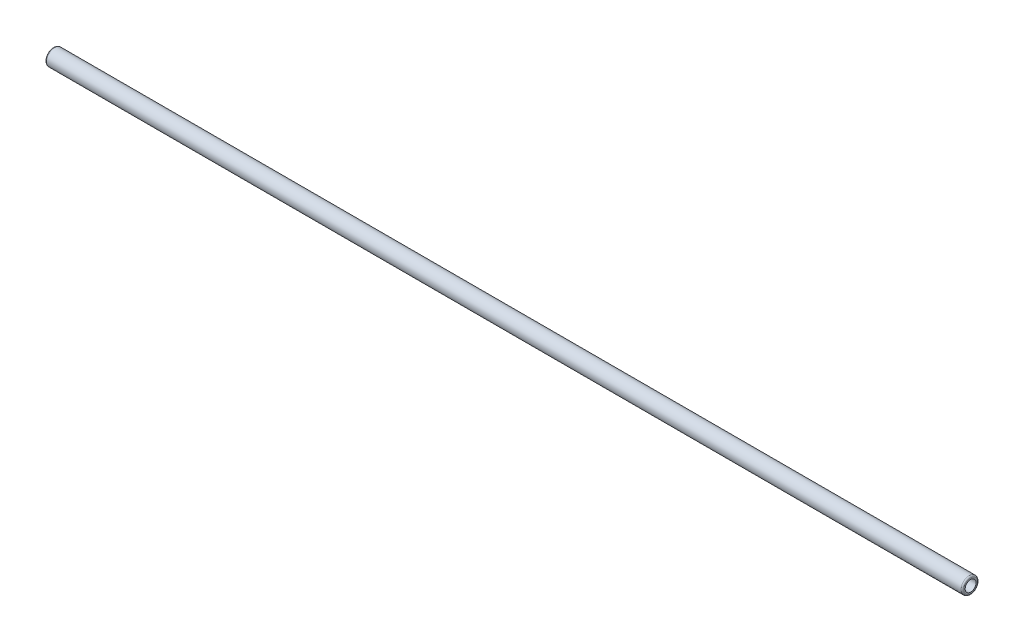
ISO-10303-21;
HEADER;
FILE_DESCRIPTION(('STEP AP214'),'2;1');
FILE_NAME('part.step','',(''),(''),'','','');
FILE_SCHEMA(('AUTOMOTIVE_DESIGN { 1 0 10303 214 1 1 1 1 }'));
ENDSEC;
DATA;
#1=APPLICATION_CONTEXT('core data for automotive mechanical design processes');
#2=APPLICATION_PROTOCOL_DEFINITION('international standard','automotive_design',2000,#1);
#3=PRODUCT_CONTEXT('',#1,'mechanical');
#4=PRODUCT('Part','Part','',(#3));
#5=PRODUCT_RELATED_PRODUCT_CATEGORY('part','',(#4));
#6=PRODUCT_DEFINITION_FORMATION('','',#4);
#7=PRODUCT_DEFINITION_CONTEXT('part definition',#1,'design');
#8=PRODUCT_DEFINITION('design','',#6,#7);
#9=PRODUCT_DEFINITION_SHAPE('','',#8);
#10=(LENGTH_UNIT() NAMED_UNIT(*) SI_UNIT(.MILLI.,.METRE.));
#11=(NAMED_UNIT(*) PLANE_ANGLE_UNIT() SI_UNIT($,.RADIAN.));
#12=(NAMED_UNIT(*) SI_UNIT($,.STERADIAN.) SOLID_ANGLE_UNIT());
#13=UNCERTAINTY_MEASURE_WITH_UNIT(LENGTH_MEASURE(1.E-05),#10,'distance_accuracy_value','');
#14=(GEOMETRIC_REPRESENTATION_CONTEXT(3) GLOBAL_UNCERTAINTY_ASSIGNED_CONTEXT((#13)) GLOBAL_UNIT_ASSIGNED_CONTEXT((#10,
#11,#12)) REPRESENTATION_CONTEXT('',''));
#15=CARTESIAN_POINT('',(0.,0.,0.));
#16=DIRECTION('',(0.,0.,1.));
#17=DIRECTION('',(1.,0.,0.));
#18=AXIS2_PLACEMENT_3D('',#15,#16,#17);
#19=CARTESIAN_POINT('',(168.,0.,0.));
#20=DIRECTION('',(1.,0.,0.));
#21=DIRECTION('',(0.,0.,-1.));
#22=AXIS2_PLACEMENT_3D('',#19,#20,#21);
#23=PLANE('',#22);
#24=CARTESIAN_POINT('',(168.,0.,0.));
#25=DIRECTION('',(1.,0.,0.));
#26=DIRECTION('',(0.,0.,-1.));
#27=AXIS2_PLACEMENT_3D('',#24,#25,#26);
#28=CIRCLE('',#27,2.5);
#29=CARTESIAN_POINT('',(168.,0.,-2.5));
#30=VERTEX_POINT('',#29);
#31=EDGE_CURVE('E10',#30,#30,#28,.T.);
#32=ORIENTED_EDGE('',*,*,#31,.T.);
#33=EDGE_LOOP('',(#32));
#34=FACE_BOUND('',#33,.T.);
#35=CARTESIAN_POINT('',(168.,0.,0.));
#36=DIRECTION('',(1.,0.,0.));
#37=DIRECTION('',(0.,0.,-1.));
#38=AXIS2_PLACEMENT_3D('',#35,#36,#37);
#39=CIRCLE('',#38,2.);
#40=CARTESIAN_POINT('',(168.,0.,2.));
#41=VERTEX_POINT('',#40);
#42=EDGE_CURVE('E53',#41,#41,#39,.T.);
#43=ORIENTED_EDGE('',*,*,#42,.F.);
#44=EDGE_LOOP('',(#43));
#45=FACE_BOUND('',#44,.T.);
#46=ADVANCED_FACE('F33',(#34,#45),#23,.T.);
#47=CARTESIAN_POINT('',(-168.,0.,0.));
#48=DIRECTION('',(1.,0.,0.));
#49=DIRECTION('',(0.,0.,-1.));
#50=AXIS2_PLACEMENT_3D('',#47,#48,#49);
#51=PLANE('',#50);
#52=CARTESIAN_POINT('',(-168.,0.,0.));
#53=DIRECTION('',(1.,0.,0.));
#54=DIRECTION('',(0.,0.,-1.));
#55=AXIS2_PLACEMENT_3D('',#52,#53,#54);
#56=CIRCLE('',#55,2.5);
#57=CARTESIAN_POINT('',(-168.,0.,-2.5));
#58=VERTEX_POINT('',#57);
#59=EDGE_CURVE('E40',#58,#58,#56,.F.);
#60=ORIENTED_EDGE('',*,*,#59,.T.);
#61=EDGE_LOOP('',(#60));
#62=FACE_BOUND('',#61,.T.);
#63=CARTESIAN_POINT('',(-168.,0.,0.));
#64=DIRECTION('',(1.,0.,0.));
#65=DIRECTION('',(0.,0.,-1.));
#66=AXIS2_PLACEMENT_3D('',#63,#64,#65);
#67=CIRCLE('',#66,2.);
#68=CARTESIAN_POINT('',(-168.,0.,2.));
#69=VERTEX_POINT('',#68);
#70=EDGE_CURVE('E54',#69,#69,#67,.T.);
#71=ORIENTED_EDGE('',*,*,#70,.T.);
#72=EDGE_LOOP('',(#71));
#73=FACE_BOUND('',#72,.T.);
#74=ADVANCED_FACE('F64',(#62,#73),#51,.F.);
#75=CARTESIAN_POINT('',(168.,0.,0.));
#76=DIRECTION('',(-1.,0.,0.));
#77=DIRECTION('',(0.,0.,1.));
#78=AXIS2_PLACEMENT_3D('',#75,#76,#77);
#79=CYLINDRICAL_SURFACE('',#78,3.);
#80=CARTESIAN_POINT('',(-167.5,0.,0.));
#81=DIRECTION('',(1.,0.,0.));
#82=DIRECTION('',(0.,0.,-1.));
#83=AXIS2_PLACEMENT_3D('',#80,#81,#82);
#84=CIRCLE('',#83,3.);
#85=CARTESIAN_POINT('',(-167.5,0.,3.));
#86=VERTEX_POINT('',#85);
#87=EDGE_CURVE('E44',#86,#86,#84,.T.);
#88=CARTESIAN_POINT('',(167.5,0.,0.));
#89=DIRECTION('',(1.,0.,0.));
#90=DIRECTION('',(0.,0.,-1.));
#91=AXIS2_PLACEMENT_3D('',#88,#89,#90);
#92=CIRCLE('',#91,3.);
#93=CARTESIAN_POINT('',(167.5,0.,3.));
#94=VERTEX_POINT('',#93);
#95=EDGE_CURVE('E48',#94,#94,#92,.F.);
#96=CARTESIAN_POINT('',(-167.5,0.,3.));
#97=CARTESIAN_POINT('',(-164.010416666667,0.,3.));
#98=CARTESIAN_POINT('',(-160.520833333333,0.,3.));
#99=CARTESIAN_POINT('',(-153.541666666667,0.,3.));
#100=CARTESIAN_POINT('',(-150.052083333333,0.,3.));
#101=CARTESIAN_POINT('',(-143.072916666667,0.,3.));
#102=CARTESIAN_POINT('',(-139.583333333333,0.,3.));
#103=CARTESIAN_POINT('',(-132.604166666667,0.,3.));
#104=CARTESIAN_POINT('',(-129.114583333333,0.,3.));
#105=CARTESIAN_POINT('',(-122.135416666667,0.,3.));
#106=CARTESIAN_POINT('',(-118.645833333333,0.,3.));
#107=CARTESIAN_POINT('',(-111.666666666667,0.,3.));
#108=CARTESIAN_POINT('',(-108.177083333333,0.,3.));
#109=CARTESIAN_POINT('',(-101.197916666667,0.,3.));
#110=CARTESIAN_POINT('',(-97.7083333333334,0.,3.));
#111=CARTESIAN_POINT('',(-90.7291666666667,0.,3.));
#112=CARTESIAN_POINT('',(-87.2395833333334,0.,3.));
#113=CARTESIAN_POINT('',(-80.2604166666667,0.,3.));
#114=CARTESIAN_POINT('',(-76.7708333333334,0.,3.));
#115=CARTESIAN_POINT('',(-69.7916666666667,0.,3.));
#116=CARTESIAN_POINT('',(-66.3020833333334,0.,3.));
#117=CARTESIAN_POINT('',(-59.3229166666667,0.,3.));
#118=CARTESIAN_POINT('',(-55.8333333333334,0.,3.));
#119=CARTESIAN_POINT('',(-48.8541666666667,0.,3.));
#120=CARTESIAN_POINT('',(-45.3645833333334,0.,3.));
#121=CARTESIAN_POINT('',(-38.3854166666667,0.,3.));
#122=CARTESIAN_POINT('',(-34.8958333333334,0.,3.));
#123=CARTESIAN_POINT('',(-27.9166666666667,0.,3.));
#124=CARTESIAN_POINT('',(-24.4270833333334,0.,3.));
#125=CARTESIAN_POINT('',(-17.4479166666667,0.,3.));
#126=CARTESIAN_POINT('',(-13.9583333333334,0.,3.));
#127=CARTESIAN_POINT('',(-6.97916666666669,0.,3.));
#128=CARTESIAN_POINT('',(-3.48958333333336,0.,3.));
#129=CARTESIAN_POINT('',(3.48958333333331,0.,3.));
#130=CARTESIAN_POINT('',(6.97916666666664,0.,3.));
#131=CARTESIAN_POINT('',(13.9583333333333,0.,3.));
#132=CARTESIAN_POINT('',(17.4479166666666,0.,3.));
#133=CARTESIAN_POINT('',(24.4270833333333,0.,3.));
#134=CARTESIAN_POINT('',(27.9166666666667,0.,3.));
#135=CARTESIAN_POINT('',(34.8958333333333,0.,3.));
#136=CARTESIAN_POINT('',(38.3854166666667,0.,3.));
#137=CARTESIAN_POINT('',(45.3645833333333,0.,3.));
#138=CARTESIAN_POINT('',(48.8541666666667,0.,3.));
#139=CARTESIAN_POINT('',(55.8333333333333,0.,3.));
#140=CARTESIAN_POINT('',(59.3229166666667,0.,3.));
#141=CARTESIAN_POINT('',(66.3020833333333,0.,3.));
#142=CARTESIAN_POINT('',(69.7916666666666,0.,3.));
#143=CARTESIAN_POINT('',(76.7708333333333,0.,3.));
#144=CARTESIAN_POINT('',(80.2604166666666,0.,3.));
#145=CARTESIAN_POINT('',(87.2395833333333,0.,3.));
#146=CARTESIAN_POINT('',(90.7291666666667,0.,3.));
#147=CARTESIAN_POINT('',(97.7083333333333,0.,3.));
#148=CARTESIAN_POINT('',(101.197916666667,0.,3.));
#149=CARTESIAN_POINT('',(108.177083333333,0.,3.));
#150=CARTESIAN_POINT('',(111.666666666667,0.,3.));
#151=CARTESIAN_POINT('',(118.645833333333,0.,3.));
#152=CARTESIAN_POINT('',(122.135416666667,0.,3.));
#153=CARTESIAN_POINT('',(129.114583333333,0.,3.));
#154=CARTESIAN_POINT('',(132.604166666667,0.,3.));
#155=CARTESIAN_POINT('',(139.583333333333,0.,3.));
#156=CARTESIAN_POINT('',(143.072916666667,0.,3.));
#157=CARTESIAN_POINT('',(150.052083333333,0.,3.));
#158=CARTESIAN_POINT('',(153.541666666667,0.,3.));
#159=CARTESIAN_POINT('',(160.520833333333,0.,3.));
#160=CARTESIAN_POINT('',(164.010416666667,0.,3.));
#161=CARTESIAN_POINT('',(167.5,0.,3.));
#162=B_SPLINE_CURVE_WITH_KNOTS('',3,(#96,#97,#98,#99,#100,#101,#102,#103,#104,#105,#106,#107,
#108,#109,#110,#111,#112,#113,#114,#115,#116,#117,#118,#119,#120,#121,#122,#123,#124,#125,#126,
#127,#128,#129,#130,#131,#132,#133,#134,#135,#136,#137,#138,#139,#140,#141,#142,#143,#144,#145,
#146,#147,#148,#149,#150,#151,#152,#153,#154,#155,#156,#157,#158,#159,#160,#161),.UNSPECIFIED.,
.F.,.F.,(4,2,2,2,2,2,2,2,2,2,2,2,2,2,2,2,2,2,2,2,2,2,2,2,2,2,2,2,2,2,2,2,4),(0.,10.46875,
20.9375,31.40625,41.875,52.34375,62.8125,73.28125,83.75,94.21875,104.6875,115.15625,125.625,
136.09375,146.5625,157.03125,167.5,177.96875,188.4375,198.90625,209.375,219.84375,230.3125,
240.78125,251.25,261.71875,272.1875,282.65625,293.125,303.59375,314.0625,324.53125,335.),.UNSPECIFIED.);
#163=EDGE_CURVE('BSEAM69',#86,#94,#162,.T.);
#164=ORIENTED_EDGE('',*,*,#87,.T.);
#165=ORIENTED_EDGE('',*,*,#95,.T.);
#166=ORIENTED_EDGE('',*,*,#163,.T.);
#167=ORIENTED_EDGE('',*,*,#163,.F.);
#168=EDGE_LOOP('',(#164,#166,#165,#167));
#169=FACE_BOUND('',#168,.T.);
#170=ADVANCED_FACE('F69',(#169),#79,.T.);
#171=CARTESIAN_POINT('',(168.,0.,0.));
#172=DIRECTION('',(-1.,0.,0.));
#173=DIRECTION('',(0.,0.,1.));
#174=AXIS2_PLACEMENT_3D('',#171,#172,#173);
#175=CYLINDRICAL_SURFACE('',#174,2.);
#176=CARTESIAN_POINT('',(168.,0.,2.));
#177=CARTESIAN_POINT('',(164.5,0.,2.));
#178=CARTESIAN_POINT('',(161.,0.,2.));
#179=CARTESIAN_POINT('',(154.,0.,2.));
#180=CARTESIAN_POINT('',(150.5,0.,2.));
#181=CARTESIAN_POINT('',(143.5,0.,2.));
#182=CARTESIAN_POINT('',(140.,0.,2.));
#183=CARTESIAN_POINT('',(133.,0.,2.));
#184=CARTESIAN_POINT('',(129.5,0.,2.));
#185=CARTESIAN_POINT('',(122.5,0.,2.));
#186=CARTESIAN_POINT('',(119.,0.,2.));
#187=CARTESIAN_POINT('',(112.,0.,2.));
#188=CARTESIAN_POINT('',(108.5,0.,2.));
#189=CARTESIAN_POINT('',(101.5,0.,2.));
#190=CARTESIAN_POINT('',(98.,0.,2.));
#191=CARTESIAN_POINT('',(91.,0.,2.));
#192=CARTESIAN_POINT('',(87.5,0.,2.));
#193=CARTESIAN_POINT('',(80.5,0.,2.));
#194=CARTESIAN_POINT('',(77.,0.,2.));
#195=CARTESIAN_POINT('',(70.,0.,2.));
#196=CARTESIAN_POINT('',(66.5,0.,2.));
#197=CARTESIAN_POINT('',(59.5,0.,2.));
#198=CARTESIAN_POINT('',(56.,0.,2.));
#199=CARTESIAN_POINT('',(49.,0.,2.));
#200=CARTESIAN_POINT('',(45.5,0.,2.));
#201=CARTESIAN_POINT('',(38.5,0.,2.));
#202=CARTESIAN_POINT('',(35.,0.,2.));
#203=CARTESIAN_POINT('',(28.,0.,2.));
#204=CARTESIAN_POINT('',(24.5,0.,2.));
#205=CARTESIAN_POINT('',(17.5,0.,2.));
#206=CARTESIAN_POINT('',(14.,0.,2.));
#207=CARTESIAN_POINT('',(6.99999999999998,0.,2.));
#208=CARTESIAN_POINT('',(3.49999999999998,0.,2.));
#209=CARTESIAN_POINT('',(-3.50000000000003,0.,2.));
#210=CARTESIAN_POINT('',(-7.00000000000003,0.,2.));
#211=CARTESIAN_POINT('',(-14.,0.,2.));
#212=CARTESIAN_POINT('',(-17.5,0.,2.));
#213=CARTESIAN_POINT('',(-24.5,0.,2.));
#214=CARTESIAN_POINT('',(-28.,0.,2.));
#215=CARTESIAN_POINT('',(-35.,0.,2.));
#216=CARTESIAN_POINT('',(-38.5,0.,2.));
#217=CARTESIAN_POINT('',(-45.5,0.,2.));
#218=CARTESIAN_POINT('',(-49.,0.,2.));
#219=CARTESIAN_POINT('',(-56.,0.,2.));
#220=CARTESIAN_POINT('',(-59.5,0.,2.));
#221=CARTESIAN_POINT('',(-66.5,0.,2.));
#222=CARTESIAN_POINT('',(-70.,0.,2.));
#223=CARTESIAN_POINT('',(-77.,0.,2.));
#224=CARTESIAN_POINT('',(-80.5,0.,2.));
#225=CARTESIAN_POINT('',(-87.5,0.,2.));
#226=CARTESIAN_POINT('',(-91.,0.,2.));
#227=CARTESIAN_POINT('',(-98.,0.,2.));
#228=CARTESIAN_POINT('',(-101.5,0.,2.));
#229=CARTESIAN_POINT('',(-108.5,0.,2.));
#230=CARTESIAN_POINT('',(-112.,0.,2.));
#231=CARTESIAN_POINT('',(-119.,0.,2.));
#232=CARTESIAN_POINT('',(-122.5,0.,2.));
#233=CARTESIAN_POINT('',(-129.5,0.,2.));
#234=CARTESIAN_POINT('',(-133.,0.,2.));
#235=CARTESIAN_POINT('',(-140.,0.,2.));
#236=CARTESIAN_POINT('',(-143.5,0.,2.));
#237=CARTESIAN_POINT('',(-150.5,0.,2.));
#238=CARTESIAN_POINT('',(-154.,0.,2.));
#239=CARTESIAN_POINT('',(-161.,0.,2.));
#240=CARTESIAN_POINT('',(-164.5,0.,2.));
#241=CARTESIAN_POINT('',(-168.,0.,2.));
#242=B_SPLINE_CURVE_WITH_KNOTS('',3,(#176,#177,#178,#179,#180,#181,#182,#183,#184,#185,#186,
#187,#188,#189,#190,#191,#192,#193,#194,#195,#196,#197,#198,#199,#200,#201,#202,#203,#204,#205,
#206,#207,#208,#209,#210,#211,#212,#213,#214,#215,#216,#217,#218,#219,#220,#221,#222,#223,#224,
#225,#226,#227,#228,#229,#230,#231,#232,#233,#234,#235,#236,#237,#238,#239,#240,#241),
.UNSPECIFIED.,.F.,.F.,(4,2,2,2,2,2,2,2,2,2,2,2,2,2,2,2,2,2,2,2,2,2,2,2,2,2,2,2,2,2,2,2,4),(0.,
10.5,21.,31.5,42.,52.5,63.,73.5,84.,94.5,105.,115.5,126.,136.5,147.,157.5,168.,178.5,189.,199.5,
210.,220.5,231.,241.5,252.,262.5,273.,283.5,294.,304.5,315.,325.5,336.),.UNSPECIFIED.);
#243=EDGE_CURVE('BSEAM60',#41,#69,#242,.T.);
#244=ORIENTED_EDGE('',*,*,#42,.T.);
#245=ORIENTED_EDGE('',*,*,#70,.F.);
#246=ORIENTED_EDGE('',*,*,#243,.T.);
#247=ORIENTED_EDGE('',*,*,#243,.F.);
#248=EDGE_LOOP('',(#244,#246,#245,#247));
#249=FACE_BOUND('',#248,.T.);
#250=ADVANCED_FACE('F60',(#249),#175,.F.);
#251=CARTESIAN_POINT('',(-167.5,0.,0.));
#252=DIRECTION('',(1.,0.,0.));
#253=DIRECTION('',(0.,0.,-1.));
#254=AXIS2_PLACEMENT_3D('',#251,#252,#253);
#255=TOROIDAL_SURFACE('',#254,2.5,0.5);
#256=ORIENTED_EDGE('',*,*,#59,.F.);
#257=EDGE_LOOP('',(#256));
#258=FACE_BOUND('',#257,.T.);
#259=ORIENTED_EDGE('',*,*,#87,.F.);
#260=EDGE_LOOP('',(#259));
#261=FACE_BOUND('',#260,.T.);
#262=ADVANCED_FACE('F75',(#258,#261),#255,.T.);
#263=CARTESIAN_POINT('',(167.5,0.,0.));
#264=DIRECTION('',(1.,0.,0.));
#265=DIRECTION('',(0.,0.,-1.));
#266=AXIS2_PLACEMENT_3D('',#263,#264,#265);
#267=TOROIDAL_SURFACE('',#266,2.5,0.5);
#268=ORIENTED_EDGE('',*,*,#95,.F.);
#269=EDGE_LOOP('',(#268));
#270=FACE_BOUND('',#269,.T.);
#271=ORIENTED_EDGE('',*,*,#31,.F.);
#272=EDGE_LOOP('',(#271));
#273=FACE_BOUND('',#272,.T.);
#274=ADVANCED_FACE('F35',(#270,#273),#267,.T.);
#275=CLOSED_SHELL('',(#46,#74,#170,#250,#262,#274));
#276=MANIFOLD_SOLID_BREP('B2',#275);
#277=ADVANCED_BREP_SHAPE_REPRESENTATION('',(#18,#276),#14);
#278=SHAPE_DEFINITION_REPRESENTATION(#9,#277);
ENDSEC;
END-ISO-10303-21;
